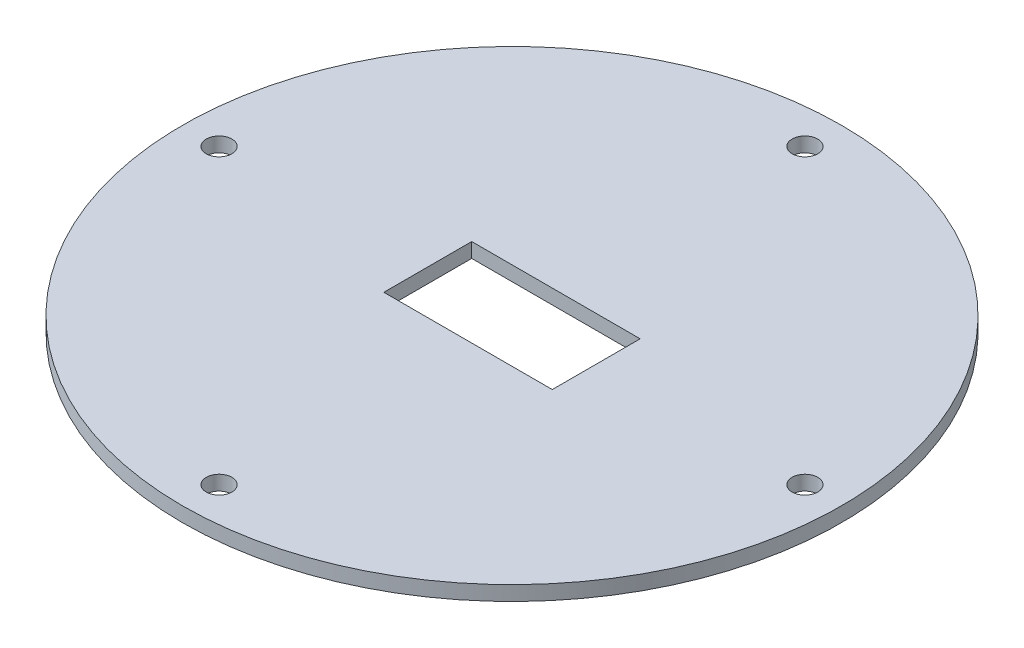
ISO-10303-21;
HEADER;
FILE_DESCRIPTION(('STEP AP214'),'2;1');
FILE_NAME('part.step','',(''),(''),'','','');
FILE_SCHEMA(('AUTOMOTIVE_DESIGN { 1 0 10303 214 1 1 1 1 }'));
ENDSEC;
DATA;
#1=APPLICATION_CONTEXT('core data for automotive mechanical design processes');
#2=APPLICATION_PROTOCOL_DEFINITION('international standard','automotive_design',2000,#1);
#3=PRODUCT_CONTEXT('',#1,'mechanical');
#4=PRODUCT('Part','Part','',(#3));
#5=PRODUCT_RELATED_PRODUCT_CATEGORY('part','',(#4));
#6=PRODUCT_DEFINITION_FORMATION('','',#4);
#7=PRODUCT_DEFINITION_CONTEXT('part definition',#1,'design');
#8=PRODUCT_DEFINITION('design','',#6,#7);
#9=PRODUCT_DEFINITION_SHAPE('','',#8);
#10=(LENGTH_UNIT() NAMED_UNIT(*) SI_UNIT(.MILLI.,.METRE.));
#11=(NAMED_UNIT(*) PLANE_ANGLE_UNIT() SI_UNIT($,.RADIAN.));
#12=(NAMED_UNIT(*) SI_UNIT($,.STERADIAN.) SOLID_ANGLE_UNIT());
#13=UNCERTAINTY_MEASURE_WITH_UNIT(LENGTH_MEASURE(1.E-05),#10,'distance_accuracy_value','');
#14=(GEOMETRIC_REPRESENTATION_CONTEXT(3) GLOBAL_UNCERTAINTY_ASSIGNED_CONTEXT((#13)) GLOBAL_UNIT_ASSIGNED_CONTEXT((#10,
#11,#12)) REPRESENTATION_CONTEXT('',''));
#15=CARTESIAN_POINT('',(0.,0.,0.));
#16=DIRECTION('',(0.,0.,1.));
#17=DIRECTION('',(1.,0.,0.));
#18=AXIS2_PLACEMENT_3D('',#15,#16,#17);
#19=CARTESIAN_POINT('',(0.,2.,0.));
#20=DIRECTION('',(0.,-1.,0.));
#21=DIRECTION('',(0.,0.,-1.));
#22=AXIS2_PLACEMENT_3D('',#19,#20,#21);
#23=CYLINDRICAL_SURFACE('',#22,45.);
#24=CARTESIAN_POINT('',(0.,2.,0.));
#25=DIRECTION('',(0.,1.,0.));
#26=DIRECTION('',(0.,0.,1.));
#27=AXIS2_PLACEMENT_3D('',#24,#25,#26);
#28=CIRCLE('',#27,45.);
#29=CARTESIAN_POINT('',(0.,2.,45.));
#30=VERTEX_POINT('',#29);
#31=EDGE_CURVE('E11',#30,#30,#28,.T.);
#32=ORIENTED_EDGE('',*,*,#31,.F.);
#33=EDGE_LOOP('',(#32));
#34=FACE_BOUND('',#33,.T.);
#35=CARTESIAN_POINT('',(0.,0.,0.));
#36=DIRECTION('',(0.,1.,0.));
#37=DIRECTION('',(0.,0.,1.));
#38=AXIS2_PLACEMENT_3D('',#35,#36,#37);
#39=CIRCLE('',#38,45.);
#40=CARTESIAN_POINT('',(0.,0.,45.));
#41=VERTEX_POINT('',#40);
#42=EDGE_CURVE('E46',#41,#41,#39,.T.);
#43=ORIENTED_EDGE('',*,*,#42,.T.);
#44=EDGE_LOOP('',(#43));
#45=FACE_BOUND('',#44,.T.);
#46=ADVANCED_FACE('F43',(#34,#45),#23,.T.);
#47=CARTESIAN_POINT('',(0.,2.,0.));
#48=DIRECTION('',(0.,1.,0.));
#49=DIRECTION('',(0.,0.,1.));
#50=AXIS2_PLACEMENT_3D('',#47,#48,#49);
#51=PLANE('',#50);
#52=DIRECTION('',(0.,0.,-1.));
#53=VECTOR('',#52,1.);
#54=CARTESIAN_POINT('',(-11.5,2.,-6.));
#55=LINE('',#54,#53);
#56=CARTESIAN_POINT('',(-11.5,2.,6.));
#57=VERTEX_POINT('',#56);
#58=CARTESIAN_POINT('',(-11.5,2.,-6.));
#59=VERTEX_POINT('',#58);
#60=EDGE_CURVE('E85',#57,#59,#55,.T.);
#61=ORIENTED_EDGE('',*,*,#60,.T.);
#62=DIRECTION('',(1.,0.,0.));
#63=VECTOR('',#62,1.);
#64=CARTESIAN_POINT('',(11.5,2.,-6.));
#65=LINE('',#64,#63);
#66=CARTESIAN_POINT('',(11.5,2.,-6.));
#67=VERTEX_POINT('',#66);
#68=EDGE_CURVE('E94',#59,#67,#65,.T.);
#69=ORIENTED_EDGE('',*,*,#68,.T.);
#70=DIRECTION('',(0.,0.,1.));
#71=VECTOR('',#70,1.);
#72=CARTESIAN_POINT('',(11.5,2.,-6.));
#73=LINE('',#72,#71);
#74=CARTESIAN_POINT('',(11.5,2.,6.));
#75=VERTEX_POINT('',#74);
#76=EDGE_CURVE('E57',#67,#75,#73,.T.);
#77=ORIENTED_EDGE('',*,*,#76,.T.);
#78=DIRECTION('',(-1.,0.,0.));
#79=VECTOR('',#78,1.);
#80=CARTESIAN_POINT('',(11.5,2.,6.));
#81=LINE('',#80,#79);
#82=EDGE_CURVE('E91',#75,#57,#81,.T.);
#83=ORIENTED_EDGE('',*,*,#82,.T.);
#84=EDGE_LOOP('',(#61,#69,#77,#83));
#85=FACE_BOUND('',#84,.T.);
#86=CARTESIAN_POINT('',(0.,2.,-40.));
#87=DIRECTION('',(0.,1.,0.));
#88=DIRECTION('',(0.,0.,1.));
#89=AXIS2_PLACEMENT_3D('',#86,#87,#88);
#90=CIRCLE('',#89,1.75);
#91=CARTESIAN_POINT('',(0.,2.,-38.25));
#92=VERTEX_POINT('',#91);
#93=EDGE_CURVE('E123',#92,#92,#90,.T.);
#94=ORIENTED_EDGE('',*,*,#93,.F.);
#95=EDGE_LOOP('',(#94));
#96=FACE_BOUND('',#95,.T.);
#97=CARTESIAN_POINT('',(40.,2.,0.));
#98=DIRECTION('',(0.,1.,0.));
#99=DIRECTION('',(0.,0.,1.));
#100=AXIS2_PLACEMENT_3D('',#97,#98,#99);
#101=CIRCLE('',#100,1.75);
#102=CARTESIAN_POINT('',(40.,2.,1.75));
#103=VERTEX_POINT('',#102);
#104=EDGE_CURVE('E126',#103,#103,#101,.T.);
#105=ORIENTED_EDGE('',*,*,#104,.F.);
#106=EDGE_LOOP('',(#105));
#107=FACE_BOUND('',#106,.T.);
#108=CARTESIAN_POINT('',(0.,2.,40.));
#109=DIRECTION('',(0.,1.,0.));
#110=DIRECTION('',(0.,0.,1.));
#111=AXIS2_PLACEMENT_3D('',#108,#109,#110);
#112=CIRCLE('',#111,1.75);
#113=CARTESIAN_POINT('',(0.,2.,41.75));
#114=VERTEX_POINT('',#113);
#115=EDGE_CURVE('E132',#114,#114,#112,.T.);
#116=ORIENTED_EDGE('',*,*,#115,.F.);
#117=EDGE_LOOP('',(#116));
#118=FACE_BOUND('',#117,.T.);
#119=CARTESIAN_POINT('',(-40.,2.,0.));
#120=DIRECTION('',(0.,1.,0.));
#121=DIRECTION('',(0.,0.,1.));
#122=AXIS2_PLACEMENT_3D('',#119,#120,#121);
#123=CIRCLE('',#122,1.75);
#124=CARTESIAN_POINT('',(-40.,2.,1.75));
#125=VERTEX_POINT('',#124);
#126=EDGE_CURVE('E138',#125,#125,#123,.T.);
#127=ORIENTED_EDGE('',*,*,#126,.F.);
#128=EDGE_LOOP('',(#127));
#129=FACE_BOUND('',#128,.T.);
#130=ORIENTED_EDGE('',*,*,#31,.T.);
#131=EDGE_LOOP('',(#130));
#132=FACE_BOUND('',#131,.T.);
#133=ADVANCED_FACE('F98',(#85,#96,#107,#118,#129,#132),#51,.T.);
#134=CARTESIAN_POINT('',(0.,0.,0.));
#135=DIRECTION('',(0.,1.,0.));
#136=DIRECTION('',(0.,0.,1.));
#137=AXIS2_PLACEMENT_3D('',#134,#135,#136);
#138=PLANE('',#137);
#139=DIRECTION('',(1.,0.,0.));
#140=VECTOR('',#139,1.);
#141=CARTESIAN_POINT('',(11.5,0.,-6.));
#142=LINE('',#141,#140);
#143=CARTESIAN_POINT('',(-11.5,0.,-6.));
#144=VERTEX_POINT('',#143);
#145=CARTESIAN_POINT('',(11.5,0.,-6.));
#146=VERTEX_POINT('',#145);
#147=EDGE_CURVE('E110',#144,#146,#142,.T.);
#148=ORIENTED_EDGE('',*,*,#147,.F.);
#149=DIRECTION('',(0.,0.,-1.));
#150=VECTOR('',#149,1.);
#151=CARTESIAN_POINT('',(-11.5,0.,-6.));
#152=LINE('',#151,#150);
#153=CARTESIAN_POINT('',(-11.5,0.,6.));
#154=VERTEX_POINT('',#153);
#155=EDGE_CURVE('E65',#154,#144,#152,.T.);
#156=ORIENTED_EDGE('',*,*,#155,.F.);
#157=DIRECTION('',(-1.,0.,0.));
#158=VECTOR('',#157,1.);
#159=CARTESIAN_POINT('',(11.5,0.,6.));
#160=LINE('',#159,#158);
#161=CARTESIAN_POINT('',(11.5,0.,6.));
#162=VERTEX_POINT('',#161);
#163=EDGE_CURVE('E101',#162,#154,#160,.T.);
#164=ORIENTED_EDGE('',*,*,#163,.F.);
#165=DIRECTION('',(0.,0.,1.));
#166=VECTOR('',#165,1.);
#167=CARTESIAN_POINT('',(11.5,0.,-6.));
#168=LINE('',#167,#166);
#169=EDGE_CURVE('E104',#146,#162,#168,.T.);
#170=ORIENTED_EDGE('',*,*,#169,.F.);
#171=EDGE_LOOP('',(#148,#156,#164,#170));
#172=FACE_BOUND('',#171,.T.);
#173=CARTESIAN_POINT('',(0.,0.,-40.));
#174=DIRECTION('',(0.,1.,0.));
#175=DIRECTION('',(0.,0.,1.));
#176=AXIS2_PLACEMENT_3D('',#173,#174,#175);
#177=CIRCLE('',#176,1.75);
#178=CARTESIAN_POINT('',(0.,0.,-38.25));
#179=VERTEX_POINT('',#178);
#180=EDGE_CURVE('E120',#179,#179,#177,.T.);
#181=ORIENTED_EDGE('',*,*,#180,.T.);
#182=EDGE_LOOP('',(#181));
#183=FACE_BOUND('',#182,.T.);
#184=CARTESIAN_POINT('',(40.,0.,0.));
#185=DIRECTION('',(0.,1.,0.));
#186=DIRECTION('',(0.,0.,1.));
#187=AXIS2_PLACEMENT_3D('',#184,#185,#186);
#188=CIRCLE('',#187,1.75);
#189=CARTESIAN_POINT('',(40.,0.,1.75));
#190=VERTEX_POINT('',#189);
#191=EDGE_CURVE('E129',#190,#190,#188,.T.);
#192=ORIENTED_EDGE('',*,*,#191,.T.);
#193=EDGE_LOOP('',(#192));
#194=FACE_BOUND('',#193,.T.);
#195=CARTESIAN_POINT('',(0.,0.,40.));
#196=DIRECTION('',(0.,1.,0.));
#197=DIRECTION('',(0.,0.,1.));
#198=AXIS2_PLACEMENT_3D('',#195,#196,#197);
#199=CIRCLE('',#198,1.75);
#200=CARTESIAN_POINT('',(0.,0.,41.75));
#201=VERTEX_POINT('',#200);
#202=EDGE_CURVE('E135',#201,#201,#199,.T.);
#203=ORIENTED_EDGE('',*,*,#202,.T.);
#204=EDGE_LOOP('',(#203));
#205=FACE_BOUND('',#204,.T.);
#206=CARTESIAN_POINT('',(-40.,0.,0.));
#207=DIRECTION('',(0.,1.,0.));
#208=DIRECTION('',(0.,0.,1.));
#209=AXIS2_PLACEMENT_3D('',#206,#207,#208);
#210=CIRCLE('',#209,1.75);
#211=CARTESIAN_POINT('',(-40.,0.,1.75));
#212=VERTEX_POINT('',#211);
#213=EDGE_CURVE('E116',#212,#212,#210,.T.);
#214=ORIENTED_EDGE('',*,*,#213,.T.);
#215=EDGE_LOOP('',(#214));
#216=FACE_BOUND('',#215,.T.);
#217=ORIENTED_EDGE('',*,*,#42,.F.);
#218=EDGE_LOOP('',(#217));
#219=FACE_BOUND('',#218,.T.);
#220=ADVANCED_FACE('F144',(#172,#183,#194,#205,#216,#219),#138,.F.);
#221=CARTESIAN_POINT('',(-40.,0.,0.));
#222=DIRECTION('',(0.,1.,0.));
#223=DIRECTION('',(0.,0.,1.));
#224=AXIS2_PLACEMENT_3D('',#221,#222,#223);
#225=CYLINDRICAL_SURFACE('',#224,1.75);
#226=ORIENTED_EDGE('',*,*,#213,.F.);
#227=EDGE_LOOP('',(#226));
#228=FACE_BOUND('',#227,.T.);
#229=ORIENTED_EDGE('',*,*,#126,.T.);
#230=EDGE_LOOP('',(#229));
#231=FACE_BOUND('',#230,.T.);
#232=ADVANCED_FACE('F147',(#228,#231),#225,.F.);
#233=CARTESIAN_POINT('',(0.,0.,40.));
#234=DIRECTION('',(0.,1.,0.));
#235=DIRECTION('',(0.,0.,1.));
#236=AXIS2_PLACEMENT_3D('',#233,#234,#235);
#237=CYLINDRICAL_SURFACE('',#236,1.75);
#238=ORIENTED_EDGE('',*,*,#202,.F.);
#239=EDGE_LOOP('',(#238));
#240=FACE_BOUND('',#239,.T.);
#241=ORIENTED_EDGE('',*,*,#115,.T.);
#242=EDGE_LOOP('',(#241));
#243=FACE_BOUND('',#242,.T.);
#244=ADVANCED_FACE('F150',(#240,#243),#237,.F.);
#245=CARTESIAN_POINT('',(40.,0.,0.));
#246=DIRECTION('',(0.,1.,0.));
#247=DIRECTION('',(0.,0.,1.));
#248=AXIS2_PLACEMENT_3D('',#245,#246,#247);
#249=CYLINDRICAL_SURFACE('',#248,1.75);
#250=ORIENTED_EDGE('',*,*,#191,.F.);
#251=EDGE_LOOP('',(#250));
#252=FACE_BOUND('',#251,.T.);
#253=ORIENTED_EDGE('',*,*,#104,.T.);
#254=EDGE_LOOP('',(#253));
#255=FACE_BOUND('',#254,.T.);
#256=ADVANCED_FACE('F172',(#252,#255),#249,.F.);
#257=CARTESIAN_POINT('',(0.,0.,-40.));
#258=DIRECTION('',(0.,1.,0.));
#259=DIRECTION('',(0.,0.,1.));
#260=AXIS2_PLACEMENT_3D('',#257,#258,#259);
#261=CYLINDRICAL_SURFACE('',#260,1.75);
#262=ORIENTED_EDGE('',*,*,#180,.F.);
#263=EDGE_LOOP('',(#262));
#264=FACE_BOUND('',#263,.T.);
#265=ORIENTED_EDGE('',*,*,#93,.T.);
#266=EDGE_LOOP('',(#265));
#267=FACE_BOUND('',#266,.T.);
#268=ADVANCED_FACE('F176',(#264,#267),#261,.F.);
#269=CARTESIAN_POINT('',(-11.5,2.,-6.));
#270=DIRECTION('',(-1.,0.,0.));
#271=DIRECTION('',(0.,0.,1.));
#272=AXIS2_PLACEMENT_3D('',#269,#270,#271);
#273=PLANE('',#272);
#274=ORIENTED_EDGE('',*,*,#155,.T.);
#275=DIRECTION('',(0.,-1.,0.));
#276=VECTOR('',#275,1.);
#277=CARTESIAN_POINT('',(-11.5,2.,-6.));
#278=LINE('',#277,#276);
#279=EDGE_CURVE('E81',#59,#144,#278,.T.);
#280=ORIENTED_EDGE('',*,*,#279,.F.);
#281=ORIENTED_EDGE('',*,*,#60,.F.);
#282=DIRECTION('',(0.,-1.,0.));
#283=VECTOR('',#282,1.);
#284=CARTESIAN_POINT('',(-11.5,2.,6.));
#285=LINE('',#284,#283);
#286=EDGE_CURVE('E114',#57,#154,#285,.T.);
#287=ORIENTED_EDGE('',*,*,#286,.T.);
#288=EDGE_LOOP('',(#274,#280,#281,#287));
#289=FACE_BOUND('',#288,.T.);
#290=ADVANCED_FACE('F83',(#289),#273,.F.);
#291=CARTESIAN_POINT('',(11.5,2.,6.));
#292=DIRECTION('',(0.,0.,1.));
#293=DIRECTION('',(1.,0.,0.));
#294=AXIS2_PLACEMENT_3D('',#291,#292,#293);
#295=PLANE('',#294);
#296=ORIENTED_EDGE('',*,*,#163,.T.);
#297=ORIENTED_EDGE('',*,*,#286,.F.);
#298=ORIENTED_EDGE('',*,*,#82,.F.);
#299=DIRECTION('',(0.,-1.,0.));
#300=VECTOR('',#299,1.);
#301=CARTESIAN_POINT('',(11.5,2.,6.));
#302=LINE('',#301,#300);
#303=EDGE_CURVE('E117',#75,#162,#302,.T.);
#304=ORIENTED_EDGE('',*,*,#303,.T.);
#305=EDGE_LOOP('',(#296,#297,#298,#304));
#306=FACE_BOUND('',#305,.T.);
#307=ADVANCED_FACE('F182',(#306),#295,.F.);
#308=CARTESIAN_POINT('',(11.5,2.,-6.));
#309=DIRECTION('',(1.,0.,0.));
#310=DIRECTION('',(0.,0.,-1.));
#311=AXIS2_PLACEMENT_3D('',#308,#309,#310);
#312=PLANE('',#311);
#313=ORIENTED_EDGE('',*,*,#169,.T.);
#314=ORIENTED_EDGE('',*,*,#303,.F.);
#315=ORIENTED_EDGE('',*,*,#76,.F.);
#316=DIRECTION('',(0.,-1.,0.));
#317=VECTOR('',#316,1.);
#318=CARTESIAN_POINT('',(11.5,2.,-6.));
#319=LINE('',#318,#317);
#320=EDGE_CURVE('E90',#67,#146,#319,.T.);
#321=ORIENTED_EDGE('',*,*,#320,.T.);
#322=EDGE_LOOP('',(#313,#314,#315,#321));
#323=FACE_BOUND('',#322,.T.);
#324=ADVANCED_FACE('F185',(#323),#312,.F.);
#325=CARTESIAN_POINT('',(11.5,2.,-6.));
#326=DIRECTION('',(0.,0.,-1.));
#327=DIRECTION('',(-1.,0.,0.));
#328=AXIS2_PLACEMENT_3D('',#325,#326,#327);
#329=PLANE('',#328);
#330=ORIENTED_EDGE('',*,*,#147,.T.);
#331=ORIENTED_EDGE('',*,*,#320,.F.);
#332=ORIENTED_EDGE('',*,*,#68,.F.);
#333=ORIENTED_EDGE('',*,*,#279,.T.);
#334=EDGE_LOOP('',(#330,#331,#332,#333));
#335=FACE_BOUND('',#334,.T.);
#336=ADVANCED_FACE('F95',(#335),#329,.F.);
#337=CLOSED_SHELL('',(#46,#133,#220,#232,#244,#256,#268,#290,#307,#324,#336));
#338=MANIFOLD_SOLID_BREP('B2',#337);
#339=ADVANCED_BREP_SHAPE_REPRESENTATION('',(#18,#338),#14);
#340=SHAPE_DEFINITION_REPRESENTATION(#9,#339);
ENDSEC;
END-ISO-10303-21;
